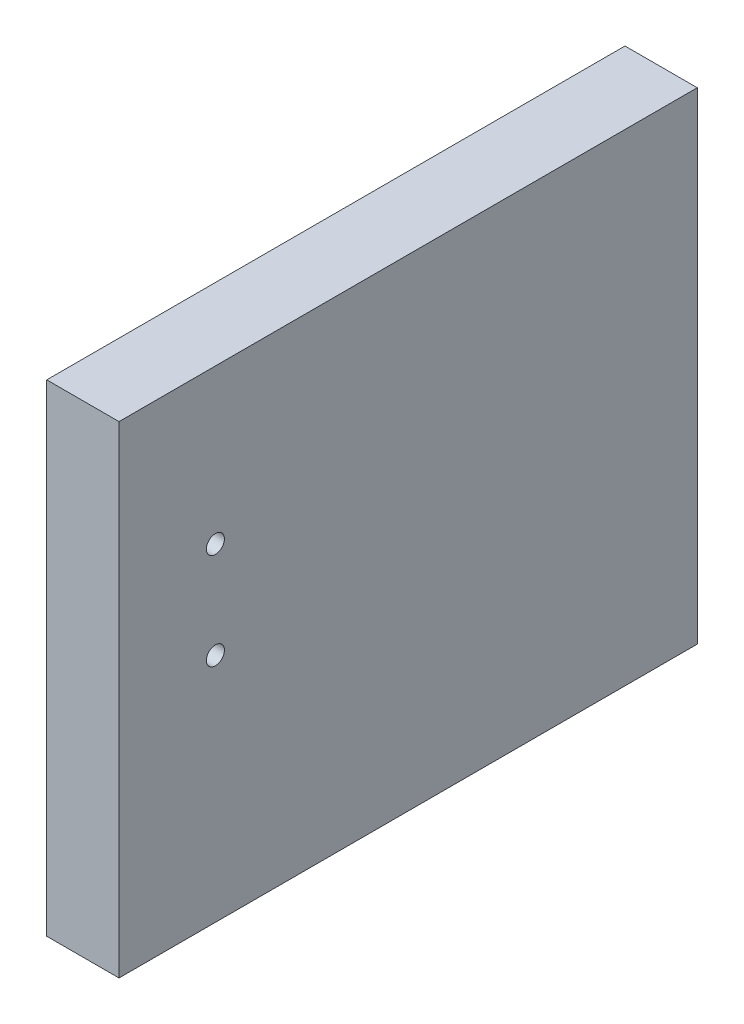
ISO-10303-21;
HEADER;
FILE_DESCRIPTION(('STEP AP214'),'2;1');
FILE_NAME('part.step','',(''),(''),'','','');
FILE_SCHEMA(('AUTOMOTIVE_DESIGN { 1 0 10303 214 1 1 1 1 }'));
ENDSEC;
DATA;
#1=APPLICATION_CONTEXT('core data for automotive mechanical design processes');
#2=APPLICATION_PROTOCOL_DEFINITION('international standard','automotive_design',2000,#1);
#3=PRODUCT_CONTEXT('',#1,'mechanical');
#4=PRODUCT('Part','Part','',(#3));
#5=PRODUCT_RELATED_PRODUCT_CATEGORY('part','',(#4));
#6=PRODUCT_DEFINITION_FORMATION('','',#4);
#7=PRODUCT_DEFINITION_CONTEXT('part definition',#1,'design');
#8=PRODUCT_DEFINITION('design','',#6,#7);
#9=PRODUCT_DEFINITION_SHAPE('','',#8);
#10=(LENGTH_UNIT() NAMED_UNIT(*) SI_UNIT(.MILLI.,.METRE.));
#11=(NAMED_UNIT(*) PLANE_ANGLE_UNIT() SI_UNIT($,.RADIAN.));
#12=(NAMED_UNIT(*) SI_UNIT($,.STERADIAN.) SOLID_ANGLE_UNIT());
#13=UNCERTAINTY_MEASURE_WITH_UNIT(LENGTH_MEASURE(1.E-05),#10,'distance_accuracy_value','');
#14=(GEOMETRIC_REPRESENTATION_CONTEXT(3) GLOBAL_UNCERTAINTY_ASSIGNED_CONTEXT((#13)) GLOBAL_UNIT_ASSIGNED_CONTEXT((#10,
#11,#12)) REPRESENTATION_CONTEXT('',''));
#15=CARTESIAN_POINT('',(0.,0.,0.));
#16=DIRECTION('',(0.,0.,1.));
#17=DIRECTION('',(1.,0.,0.));
#18=AXIS2_PLACEMENT_3D('',#15,#16,#17);
#19=CARTESIAN_POINT('',(9.52499999999999,63.5,-152.4));
#20=DIRECTION('',(-1.,0.,0.));
#21=DIRECTION('',(0.,-1.,0.));
#22=AXIS2_PLACEMENT_3D('',#19,#20,#21);
#23=PLANE('',#22);
#24=CARTESIAN_POINT('',(9.525,-2.54,-25.4));
#25=DIRECTION('',(-1.,0.,0.));
#26=DIRECTION('',(0.,1.,0.));
#27=AXIS2_PLACEMENT_3D('',#24,#25,#26);
#28=CIRCLE('',#27,2.38125);
#29=CARTESIAN_POINT('',(9.525,-0.158750000000003,-25.4));
#30=VERTEX_POINT('',#29);
#31=EDGE_CURVE('E130',#30,#30,#28,.T.);
#32=ORIENTED_EDGE('',*,*,#31,.T.);
#33=EDGE_LOOP('',(#32));
#34=FACE_BOUND('',#33,.T.);
#35=CARTESIAN_POINT('',(9.525,22.86,-25.4));
#36=DIRECTION('',(-1.,0.,0.));
#37=DIRECTION('',(0.,1.,0.));
#38=AXIS2_PLACEMENT_3D('',#35,#36,#37);
#39=CIRCLE('',#38,2.38125000000001);
#40=CARTESIAN_POINT('',(9.525,25.24125,-25.4));
#41=VERTEX_POINT('',#40);
#42=EDGE_CURVE('E133',#41,#41,#39,.T.);
#43=ORIENTED_EDGE('',*,*,#42,.T.);
#44=EDGE_LOOP('',(#43));
#45=FACE_BOUND('',#44,.T.);
#46=DIRECTION('',(0.,1.,0.));
#47=VECTOR('',#46,1.);
#48=CARTESIAN_POINT('',(9.52499999999999,63.5,0.));
#49=LINE('',#48,#47);
#50=CARTESIAN_POINT('',(9.52500000000001,-63.5,0.));
#51=VERTEX_POINT('',#50);
#52=CARTESIAN_POINT('',(9.52499999999999,63.5,0.));
#53=VERTEX_POINT('',#52);
#54=EDGE_CURVE('E99',#51,#53,#49,.T.);
#55=ORIENTED_EDGE('',*,*,#54,.F.);
#56=DIRECTION('',(0.,0.,1.));
#57=VECTOR('',#56,1.);
#58=CARTESIAN_POINT('',(9.52500000000001,-63.5,-152.4));
#59=LINE('',#58,#57);
#60=CARTESIAN_POINT('',(9.52500000000001,-63.5,-152.4));
#61=VERTEX_POINT('',#60);
#62=EDGE_CURVE('E98',#61,#51,#59,.T.);
#63=ORIENTED_EDGE('',*,*,#62,.F.);
#64=DIRECTION('',(0.,1.,0.));
#65=VECTOR('',#64,1.);
#66=CARTESIAN_POINT('',(9.52499999999999,63.5,-152.4));
#67=LINE('',#66,#65);
#68=CARTESIAN_POINT('',(9.52499999999999,63.5,-152.4));
#69=VERTEX_POINT('',#68);
#70=EDGE_CURVE('E92',#61,#69,#67,.T.);
#71=ORIENTED_EDGE('',*,*,#70,.T.);
#72=DIRECTION('',(0.,0.,1.));
#73=VECTOR('',#72,1.);
#74=CARTESIAN_POINT('',(9.52499999999999,63.5,-152.4));
#75=LINE('',#74,#73);
#76=EDGE_CURVE('E11',#69,#53,#75,.T.);
#77=ORIENTED_EDGE('',*,*,#76,.T.);
#78=EDGE_LOOP('',(#55,#63,#71,#77));
#79=FACE_BOUND('',#78,.T.);
#80=ADVANCED_FACE('F35',(#34,#45,#79),#23,.F.);
#81=CARTESIAN_POINT('',(-9.52500000000001,63.5,-152.4));
#82=DIRECTION('',(0.,-1.,0.));
#83=DIRECTION('',(0.,0.,1.));
#84=AXIS2_PLACEMENT_3D('',#81,#82,#83);
#85=PLANE('',#84);
#86=DIRECTION('',(-1.,0.,0.));
#87=VECTOR('',#86,1.);
#88=CARTESIAN_POINT('',(-9.52500000000001,63.5,0.));
#89=LINE('',#88,#87);
#90=CARTESIAN_POINT('',(-9.52500000000001,63.5,0.));
#91=VERTEX_POINT('',#90);
#92=EDGE_CURVE('E101',#53,#91,#89,.T.);
#93=ORIENTED_EDGE('',*,*,#92,.F.);
#94=ORIENTED_EDGE('',*,*,#76,.F.);
#95=DIRECTION('',(-1.,0.,0.));
#96=VECTOR('',#95,1.);
#97=CARTESIAN_POINT('',(-9.52500000000001,63.5,-152.4));
#98=LINE('',#97,#96);
#99=CARTESIAN_POINT('',(-9.52500000000001,63.5,-152.4));
#100=VERTEX_POINT('',#99);
#101=EDGE_CURVE('E76',#69,#100,#98,.T.);
#102=ORIENTED_EDGE('',*,*,#101,.T.);
#103=DIRECTION('',(0.,0.,1.));
#104=VECTOR('',#103,1.);
#105=CARTESIAN_POINT('',(-9.52500000000001,63.5,-152.4));
#106=LINE('',#105,#104);
#107=EDGE_CURVE('E43',#100,#91,#106,.T.);
#108=ORIENTED_EDGE('',*,*,#107,.T.);
#109=EDGE_LOOP('',(#93,#94,#102,#108));
#110=FACE_BOUND('',#109,.T.);
#111=ADVANCED_FACE('F90',(#110),#85,.F.);
#112=CARTESIAN_POINT('',(-9.52500000000001,63.5,-152.4));
#113=DIRECTION('',(1.,0.,0.));
#114=DIRECTION('',(0.,1.,0.));
#115=AXIS2_PLACEMENT_3D('',#112,#113,#114);
#116=PLANE('',#115);
#117=CARTESIAN_POINT('',(-9.52500000000002,-2.54,-25.4));
#118=DIRECTION('',(-1.,0.,0.));
#119=DIRECTION('',(0.,1.,0.));
#120=AXIS2_PLACEMENT_3D('',#117,#118,#119);
#121=CIRCLE('',#120,2.38125);
#122=CARTESIAN_POINT('',(-9.52500000000002,-0.158750000000005,-25.4));
#123=VERTEX_POINT('',#122);
#124=EDGE_CURVE('E135',#123,#123,#121,.T.);
#125=ORIENTED_EDGE('',*,*,#124,.F.);
#126=EDGE_LOOP('',(#125));
#127=FACE_BOUND('',#126,.T.);
#128=CARTESIAN_POINT('',(-9.52500000000002,22.86,-25.4));
#129=DIRECTION('',(-1.,0.,0.));
#130=DIRECTION('',(0.,1.,0.));
#131=AXIS2_PLACEMENT_3D('',#128,#129,#130);
#132=CIRCLE('',#131,2.38125000000001);
#133=CARTESIAN_POINT('',(-9.52500000000002,25.24125,-25.4));
#134=VERTEX_POINT('',#133);
#135=EDGE_CURVE('E102',#134,#134,#132,.T.);
#136=ORIENTED_EDGE('',*,*,#135,.F.);
#137=EDGE_LOOP('',(#136));
#138=FACE_BOUND('',#137,.T.);
#139=DIRECTION('',(0.,-1.,0.));
#140=VECTOR('',#139,1.);
#141=CARTESIAN_POINT('',(-9.52500000000001,63.5,0.));
#142=LINE('',#141,#140);
#143=CARTESIAN_POINT('',(-9.525,-63.5,0.));
#144=VERTEX_POINT('',#143);
#145=EDGE_CURVE('E86',#91,#144,#142,.T.);
#146=ORIENTED_EDGE('',*,*,#145,.F.);
#147=ORIENTED_EDGE('',*,*,#107,.F.);
#148=DIRECTION('',(0.,-1.,0.));
#149=VECTOR('',#148,1.);
#150=CARTESIAN_POINT('',(-9.52500000000001,63.5,-152.4));
#151=LINE('',#150,#149);
#152=CARTESIAN_POINT('',(-9.525,-63.5,-152.4));
#153=VERTEX_POINT('',#152);
#154=EDGE_CURVE('E79',#100,#153,#151,.T.);
#155=ORIENTED_EDGE('',*,*,#154,.T.);
#156=DIRECTION('',(0.,0.,1.));
#157=VECTOR('',#156,1.);
#158=CARTESIAN_POINT('',(-9.525,-63.5,-152.4));
#159=LINE('',#158,#157);
#160=EDGE_CURVE('E89',#153,#144,#159,.T.);
#161=ORIENTED_EDGE('',*,*,#160,.T.);
#162=EDGE_LOOP('',(#146,#147,#155,#161));
#163=FACE_BOUND('',#162,.T.);
#164=ADVANCED_FACE('F85',(#127,#138,#163),#116,.F.);
#165=CARTESIAN_POINT('',(-9.525,-63.5,-152.4));
#166=DIRECTION('',(0.,1.,0.));
#167=DIRECTION('',(0.,0.,-1.));
#168=AXIS2_PLACEMENT_3D('',#165,#166,#167);
#169=PLANE('',#168);
#170=DIRECTION('',(1.,0.,0.));
#171=VECTOR('',#170,1.);
#172=CARTESIAN_POINT('',(-9.525,-63.5,0.));
#173=LINE('',#172,#171);
#174=EDGE_CURVE('E65',#144,#51,#173,.T.);
#175=ORIENTED_EDGE('',*,*,#174,.F.);
#176=ORIENTED_EDGE('',*,*,#160,.F.);
#177=DIRECTION('',(1.,0.,0.));
#178=VECTOR('',#177,1.);
#179=CARTESIAN_POINT('',(-9.525,-63.5,-152.4));
#180=LINE('',#179,#178);
#181=EDGE_CURVE('E51',#153,#61,#180,.T.);
#182=ORIENTED_EDGE('',*,*,#181,.T.);
#183=ORIENTED_EDGE('',*,*,#62,.T.);
#184=EDGE_LOOP('',(#175,#176,#182,#183));
#185=FACE_BOUND('',#184,.T.);
#186=ADVANCED_FACE('F111',(#185),#169,.F.);
#187=CARTESIAN_POINT('',(0.,0.,-152.4));
#188=DIRECTION('',(0.,0.,-1.));
#189=DIRECTION('',(1.,0.,0.));
#190=AXIS2_PLACEMENT_3D('',#187,#188,#189);
#191=PLANE('',#190);
#192=ORIENTED_EDGE('',*,*,#70,.F.);
#193=ORIENTED_EDGE('',*,*,#181,.F.);
#194=ORIENTED_EDGE('',*,*,#154,.F.);
#195=ORIENTED_EDGE('',*,*,#101,.F.);
#196=EDGE_LOOP('',(#192,#193,#194,#195));
#197=FACE_BOUND('',#196,.T.);
#198=ADVANCED_FACE('F81',(#197),#191,.T.);
#199=CARTESIAN_POINT('',(0.,0.,0.));
#200=DIRECTION('',(0.,0.,-1.));
#201=DIRECTION('',(1.,0.,0.));
#202=AXIS2_PLACEMENT_3D('',#199,#200,#201);
#203=PLANE('',#202);
#204=ORIENTED_EDGE('',*,*,#54,.T.);
#205=ORIENTED_EDGE('',*,*,#92,.T.);
#206=ORIENTED_EDGE('',*,*,#145,.T.);
#207=ORIENTED_EDGE('',*,*,#174,.T.);
#208=EDGE_LOOP('',(#204,#205,#206,#207));
#209=FACE_BOUND('',#208,.T.);
#210=ADVANCED_FACE('F107',(#209),#203,.F.);
#211=CARTESIAN_POINT('',(-9.52500000000002,22.86,-25.4));
#212=DIRECTION('',(1.,0.,0.));
#213=DIRECTION('',(0.,1.,0.));
#214=AXIS2_PLACEMENT_3D('',#211,#212,#213);
#215=CYLINDRICAL_SURFACE('',#214,2.38125000000001);
#216=ORIENTED_EDGE('',*,*,#135,.T.);
#217=EDGE_LOOP('',(#216));
#218=FACE_BOUND('',#217,.T.);
#219=ORIENTED_EDGE('',*,*,#42,.F.);
#220=EDGE_LOOP('',(#219));
#221=FACE_BOUND('',#220,.T.);
#222=ADVANCED_FACE('F148',(#218,#221),#215,.F.);
#223=CARTESIAN_POINT('',(-9.52500000000002,-2.54,-25.4));
#224=DIRECTION('',(1.,0.,0.));
#225=DIRECTION('',(0.,1.,0.));
#226=AXIS2_PLACEMENT_3D('',#223,#224,#225);
#227=CYLINDRICAL_SURFACE('',#226,2.38125);
#228=ORIENTED_EDGE('',*,*,#124,.T.);
#229=EDGE_LOOP('',(#228));
#230=FACE_BOUND('',#229,.T.);
#231=ORIENTED_EDGE('',*,*,#31,.F.);
#232=EDGE_LOOP('',(#231));
#233=FACE_BOUND('',#232,.T.);
#234=ADVANCED_FACE('F143',(#230,#233),#227,.F.);
#235=CLOSED_SHELL('',(#80,#111,#164,#186,#198,#210,#222,#234));
#236=MANIFOLD_SOLID_BREP('B2',#235);
#237=ADVANCED_BREP_SHAPE_REPRESENTATION('',(#18,#236),#14);
#238=SHAPE_DEFINITION_REPRESENTATION(#9,#237);
ENDSEC;
END-ISO-10303-21;
